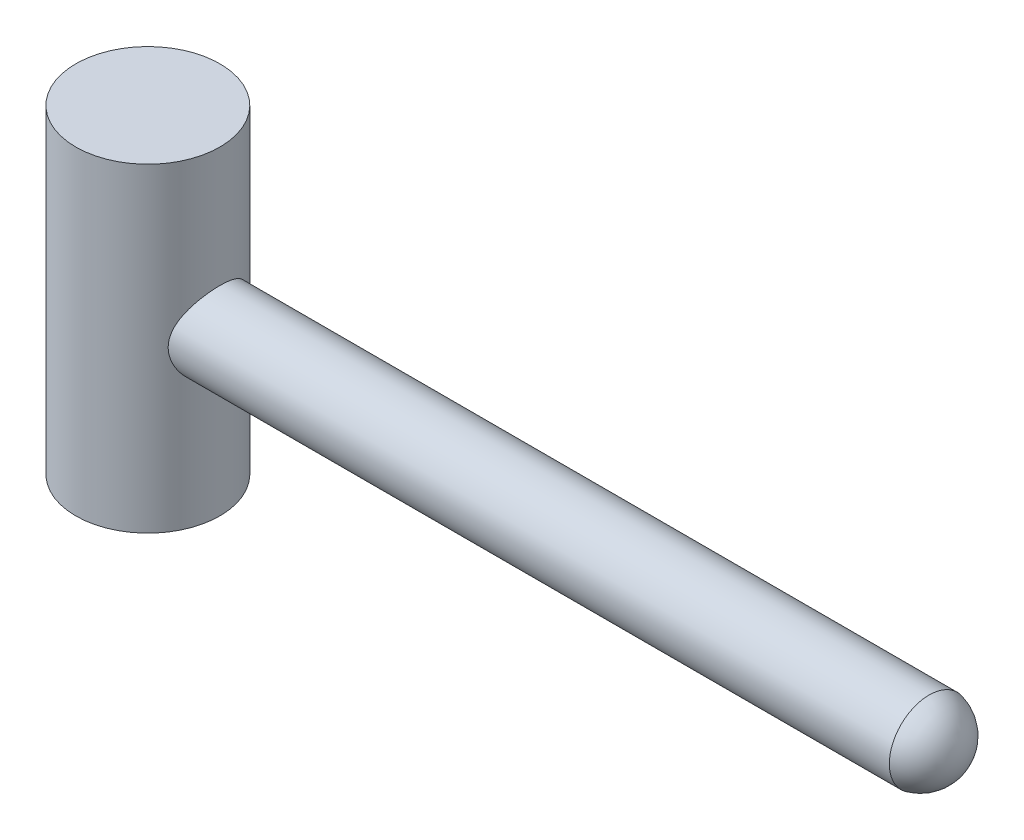
ISO-10303-21;
HEADER;
FILE_DESCRIPTION(('STEP AP214'),'2;1');
FILE_NAME('part.step','',(''),(''),'','','');
FILE_SCHEMA(('AUTOMOTIVE_DESIGN { 1 0 10303 214 1 1 1 1 }'));
ENDSEC;
DATA;
#1=APPLICATION_CONTEXT('core data for automotive mechanical design processes');
#2=APPLICATION_PROTOCOL_DEFINITION('international standard','automotive_design',2000,#1);
#3=PRODUCT_CONTEXT('',#1,'mechanical');
#4=PRODUCT('Part','Part','',(#3));
#5=PRODUCT_RELATED_PRODUCT_CATEGORY('part','',(#4));
#6=PRODUCT_DEFINITION_FORMATION('','',#4);
#7=PRODUCT_DEFINITION_CONTEXT('part definition',#1,'design');
#8=PRODUCT_DEFINITION('design','',#6,#7);
#9=PRODUCT_DEFINITION_SHAPE('','',#8);
#10=(LENGTH_UNIT() NAMED_UNIT(*) SI_UNIT(.MILLI.,.METRE.));
#11=(NAMED_UNIT(*) PLANE_ANGLE_UNIT() SI_UNIT($,.RADIAN.));
#12=(NAMED_UNIT(*) SI_UNIT($,.STERADIAN.) SOLID_ANGLE_UNIT());
#13=UNCERTAINTY_MEASURE_WITH_UNIT(LENGTH_MEASURE(1.E-05),#10,'distance_accuracy_value','');
#14=(GEOMETRIC_REPRESENTATION_CONTEXT(3) GLOBAL_UNCERTAINTY_ASSIGNED_CONTEXT((#13)) GLOBAL_UNIT_ASSIGNED_CONTEXT((#10,
#11,#12)) REPRESENTATION_CONTEXT('',''));
#15=CARTESIAN_POINT('',(0.,0.,0.));
#16=DIRECTION('',(0.,0.,1.));
#17=DIRECTION('',(1.,0.,0.));
#18=AXIS2_PLACEMENT_3D('',#15,#16,#17);
#19=CARTESIAN_POINT('',(122.61083828125,25.35555,0.));
#20=DIRECTION('',(0.,0.,1.));
#21=DIRECTION('',(1.,0.,0.));
#22=AXIS2_PLACEMENT_3D('',#19,#20,#21);
#23=SPHERICAL_SURFACE('',#22,6.46916171875);
#24=CARTESIAN_POINT('',(122.61083828125,25.35555,0.));
#25=DIRECTION('',(1.,0.,0.));
#26=DIRECTION('',(0.,0.,-1.));
#27=AXIS2_PLACEMENT_3D('',#24,#25,#26);
#28=SPHERICAL_SURFACE('',#27,6.46916171875);
#29=CARTESIAN_POINT('',(124.,25.35555,0.));
#30=DIRECTION('',(1.,0.,0.));
#31=DIRECTION('',(0.,0.,-1.));
#32=AXIS2_PLACEMENT_3D('',#29,#30,#31);
#33=CIRCLE('',#32,6.31825);
#34=CARTESIAN_POINT('',(124.,25.35555,-6.31825));
#35=VERTEX_POINT('',#34);
#36=EDGE_CURVE('E46',#35,#35,#33,.T.);
#37=ORIENTED_EDGE('',*,*,#36,.T.);
#38=EDGE_LOOP('',(#37));
#39=FACE_BOUND('',#38,.T.);
#40=ADVANCED_FACE('F43',(#39),#28,.T.);
#41=CARTESIAN_POINT('',(-11.4437,25.35555,0.));
#42=DIRECTION('',(1.,0.,0.));
#43=DIRECTION('',(0.,0.,-1.));
#44=AXIS2_PLACEMENT_3D('',#41,#42,#43);
#45=CYLINDRICAL_SURFACE('',#44,6.31825);
#46=ORIENTED_EDGE('',*,*,#36,.F.);
#47=EDGE_LOOP('',(#46));
#48=FACE_BOUND('',#47,.T.);
#49=CARTESIAN_POINT('',(9.54018344831482,25.35555,-6.31825));
#50=CARTESIAN_POINT('',(9.54018083450571,25.5174026483117,-6.31825193716623));
#51=CARTESIAN_POINT('',(9.54431541598027,25.6792345645507,-6.31202368990268));
#52=CARTESIAN_POINT('',(9.56067795907703,26.001592677448,-6.28721284744562));
#53=CARTESIAN_POINT('',(9.57290851539357,26.1621184387925,-6.26862629150579));
#54=CARTESIAN_POINT('',(9.60499472694268,26.4807092664191,-6.21935034099246));
#55=CARTESIAN_POINT('',(9.62485935965734,26.6387712067256,-6.18864669587816));
#56=CARTESIAN_POINT('',(9.67146819999295,26.9511925238964,-6.11555079440456));
#57=CARTESIAN_POINT('',(9.69821549059936,27.1055502075305,-6.07315329934378));
#58=CARTESIAN_POINT('',(9.7574543259979,27.408533890213,-5.97750831606688));
#59=CARTESIAN_POINT('',(9.7899057269653,27.5571916355862,-5.92433628035336));
#60=CARTESIAN_POINT('',(9.85967018013938,27.8491647397997,-5.80748795258423));
#61=CARTESIAN_POINT('',(9.89698502218243,27.9924781067135,-5.74380779103673));
#62=CARTESIAN_POINT('',(10.0146317823642,28.4133707438515,-5.53782734180906));
#63=CARTESIAN_POINT('',(10.1007135163746,28.6821319599226,-5.38051374205728));
#64=CARTESIAN_POINT('',(10.2890953952598,29.2181636164552,-5.01167571487228));
#65=CARTESIAN_POINT('',(10.3921543154347,29.4824896715789,-4.79625999310393));
#66=CARTESIAN_POINT('',(10.545539677052,29.8506261094333,-4.44336925767475));
#67=CARTESIAN_POINT('',(10.5964998662239,29.9686792927549,-4.32068972865352));
#68=CARTESIAN_POINT('',(10.6968893853317,30.1948291258404,-4.06579388094318));
#69=CARTESIAN_POINT('',(10.7463184577425,30.3029241066632,-3.93357597026943));
#70=CARTESIAN_POINT('',(10.8466753405652,30.5174312066391,-3.64826495023383));
#71=CARTESIAN_POINT('',(10.8973584262176,30.622875900733,-3.49435675412639));
#72=CARTESIAN_POINT('',(10.9941216278436,30.8202555028633,-3.17682261796556));
#73=CARTESIAN_POINT('',(11.0402037525615,30.9121963149234,-3.01320096892584));
#74=CARTESIAN_POINT('',(11.1264539664538,31.0816477451478,-2.67721366859669));
#75=CARTESIAN_POINT('',(11.1666240130375,31.1591631416307,-2.50485093688985));
#76=CARTESIAN_POINT('',(11.2398502232944,31.2988380153705,-2.15255665331606));
#77=CARTESIAN_POINT('',(11.2729073423789,31.3609995551303,-1.97262612184548));
#78=CARTESIAN_POINT('',(11.3284311476939,31.4645594020492,-1.6219907629106));
#79=CARTESIAN_POINT('',(11.351552551889,31.5072598751589,-1.45177381338647));
#80=CARTESIAN_POINT('',(11.39028996694,31.5784512395761,-1.10754875516793));
#81=CARTESIAN_POINT('',(11.4059063609973,31.606942856382,-0.933540840512275));
#82=CARTESIAN_POINT('',(11.4291679613515,31.6492844197094,-0.583335521032256));
#83=CARTESIAN_POINT('',(11.4368182806275,31.6631437579539,-0.407139594160962));
#84=CARTESIAN_POINT('',(11.4439343409746,31.6760376331608,-0.0540465185126677));
#85=CARTESIAN_POINT('',(11.4434007373399,31.6750733570637,0.122850572987492));
#86=CARTESIAN_POINT('',(11.4346590427355,31.6592283100193,0.457027885252577));
#87=CARTESIAN_POINT('',(11.4272692497607,31.645831358497,0.614402614893631));
#88=CARTESIAN_POINT('',(11.4061395473673,31.6073640161748,0.927341807384519));
#89=CARTESIAN_POINT('',(11.3923975289374,31.5822897483521,1.08290565140035));
#90=CARTESIAN_POINT('',(11.3588905228775,31.5207716421278,1.39104365098228));
#91=CARTESIAN_POINT('',(11.3391276420118,31.4843317805635,1.54361883247003));
#92=CARTESIAN_POINT('',(11.2940179234123,31.4004643415916,1.844928788867));
#93=CARTESIAN_POINT('',(11.2686689076748,31.3530324780888,1.99366204048838));
#94=CARTESIAN_POINT('',(11.2126570039406,31.2471219033813,2.28787046353328));
#95=CARTESIAN_POINT('',(11.1819427833033,31.1885359356642,2.43329723164134));
#96=CARTESIAN_POINT('',(11.116031930798,31.0611634348307,2.7185817296359));
#97=CARTESIAN_POINT('',(11.0808337956905,30.9923734795336,2.85843757112398));
#98=CARTESIAN_POINT('',(10.9695818113794,30.7715340965249,3.26859996716568));
#99=CARTESIAN_POINT('',(10.8878343316732,30.6049488647042,3.52968360924174));
#100=CARTESIAN_POINT('',(10.7060396033736,30.2172986616059,4.04969324633373));
#101=CARTESIAN_POINT('',(10.6049692405009,29.9922856200651,4.3053176773251));
#102=CARTESIAN_POINT('',(10.452079753232,29.6267438590519,4.65897195333611));
#103=CARTESIAN_POINT('',(10.4008584261284,29.5001064067945,4.77197650400648));
#104=CARTESIAN_POINT('',(10.2991849081828,29.2379103820021,4.98762077818439));
#105=CARTESIAN_POINT('',(10.2487328551366,29.1023502337869,5.09025866286293));
#106=CARTESIAN_POINT('',(10.1454802537442,28.810392859961,5.29327162179075));
#107=CARTESIAN_POINT('',(10.0928724866809,28.6532159938287,5.39262560903304));
#108=CARTESIAN_POINT('',(9.99186583673085,28.329750763453,5.57755304227524));
#109=CARTESIAN_POINT('',(9.94346507048578,28.1634665312419,5.66313266944357));
#110=CARTESIAN_POINT('',(9.85266367450871,27.8226986251384,5.81967273107332));
#111=CARTESIAN_POINT('',(9.81025912606465,27.6482204065313,5.89064272733038));
#112=CARTESIAN_POINT('',(9.73319553671579,27.2920898332284,6.01712419193141));
#113=CARTESIAN_POINT('',(9.69853524115111,27.1104386462573,6.07263816469182));
#114=CARTESIAN_POINT('',(9.6410124228877,26.7562783079375,6.1635152022213));
#115=CARTESIAN_POINT('',(9.61742439812244,26.5842116259138,6.20014137176319));
#116=CARTESIAN_POINT('',(9.57922774567819,26.2366401641717,6.25899502028769));
#117=CARTESIAN_POINT('',(9.5646185381747,26.0611356072162,6.28122342903857));
#118=CARTESIAN_POINT('',(9.54508923026198,25.7085153463077,6.31086147217007));
#119=CARTESIAN_POINT('',(9.54015945859028,25.531401428349,6.31828589814829));
#120=CARTESIAN_POINT('',(9.54020760412019,25.1771881077736,6.31821385255547));
#121=CARTESIAN_POINT('',(9.54518442024437,25.0000887057314,6.31071903919795));
#122=CARTESIAN_POINT('',(9.5633410550197,24.6737037568798,6.28316042864985));
#123=CARTESIAN_POINT('',(9.57520282169451,24.5241682615774,6.26511335924048));
#124=CARTESIAN_POINT('',(9.60552370934576,24.2273732833519,6.21852645105008));
#125=CARTESIAN_POINT('',(9.62398493949125,24.0801145437881,6.18998325765507));
#126=CARTESIAN_POINT('',(9.66689971041823,23.7888331692112,6.12274603477511));
#127=CARTESIAN_POINT('',(9.69135309621818,23.6448104506067,6.08405226782347));
#128=CARTESIAN_POINT('',(9.74550758145019,23.3607326255178,5.9969236926659));
#129=CARTESIAN_POINT('',(9.7752107887268,23.2206791390185,5.94848497069976));
#130=CARTESIAN_POINT('',(9.87361696981369,22.796071648613,5.78478427369969));
#131=CARTESIAN_POINT('',(9.94975291722133,22.5190725616918,5.65391365749246));
#132=CARTESIAN_POINT('',(10.1134480662533,21.9894769099628,5.35560492743553));
#133=CARTESIAN_POINT('',(10.2010128826616,21.7368924464548,5.18814881240195));
#134=CARTESIAN_POINT('',(10.3945533384985,21.2206149511117,4.79008766212784));
#135=CARTESIAN_POINT('',(10.5012336432458,20.9616064074973,4.55366626720769));
#136=CARTESIAN_POINT('',(10.6572272045517,20.6044626450312,4.16871657809543));
#137=CARTESIAN_POINT('',(10.7085874053152,20.4905762624365,4.03524615433454));
#138=CARTESIAN_POINT('',(10.8087765961234,20.2738382261951,3.75863475188307));
#139=CARTESIAN_POINT('',(10.8576052370842,20.1709880922873,3.61549244574417));
#140=CARTESIAN_POINT('',(10.9539558573926,19.9720555010237,3.31252326955556));
#141=CARTESIAN_POINT('',(11.0012764665065,19.8766068733863,3.15221547468949));
#142=CARTESIAN_POINT('',(11.0904079734455,19.6997672438501,2.82264952650407));
#143=CARTESIAN_POINT('',(11.1322214934511,19.6183695458748,2.65339568700172));
#144=CARTESIAN_POINT('',(11.2091092769328,19.4705680203339,2.30709548342573));
#145=CARTESIAN_POINT('',(11.2441874347245,19.4041555245676,2.13005369549112));
#146=CARTESIAN_POINT('',(11.3065370517694,19.2871785062341,1.76947939198127));
#147=CARTESIAN_POINT('',(11.3338096806732,19.2366116091121,1.58594785352441));
#148=CARTESIAN_POINT('',(11.3773137114536,19.1564228322756,1.23305398186738));
#149=CARTESIAN_POINT('',(11.39438871767,19.1251884394831,1.06416072349592));
#150=CARTESIAN_POINT('',(11.4210598293378,19.0765434113741,0.72381040611467));
#151=CARTESIAN_POINT('',(11.4306564500338,19.0591318236947,0.552353524562676));
#152=CARTESIAN_POINT('',(11.4420953000866,19.0383893143024,0.208409610648593));
#153=CARTESIAN_POINT('',(11.4439410054889,19.0350520806746,0.0359230748181656));
#154=CARTESIAN_POINT('',(11.4398339122471,19.0424912714338,-0.308647615296851));
#155=CARTESIAN_POINT('',(11.4338815127189,19.0532669735046,-0.480731789723191));
#156=CARTESIAN_POINT('',(11.4152396761079,19.0871552013095,-0.807458213504667));
#157=CARTESIAN_POINT('',(11.4032108851495,19.1090589800796,-0.962265686486694));
#158=CARTESIAN_POINT('',(11.3731270615357,19.1641485396049,-1.26931736145731));
#159=CARTESIAN_POINT('',(11.3550700157174,19.1973380893634,-1.42156068927259));
#160=CARTESIAN_POINT('',(11.3133440893793,19.2746199010994,-1.72240736469467));
#161=CARTESIAN_POINT('',(11.2896769988914,19.3187086855825,-1.87101185671468));
#162=CARTESIAN_POINT('',(11.237231479519,19.4173671105332,-2.16382736847649));
#163=CARTESIAN_POINT('',(11.2084510576831,19.4719408382473,-2.30803664939061));
#164=CARTESIAN_POINT('',(11.14534502107,19.5930524616944,-2.59597770929443));
#165=CARTESIAN_POINT('',(11.1108668261722,19.6599278795733,-2.73953412071516));
#166=CARTESIAN_POINT('',(11.0378194327741,19.8037767739834,-3.02043377712664));
#167=CARTESIAN_POINT('',(10.9992488497666,19.8807536700731,-3.15777489684402));
#168=CARTESIAN_POINT('',(10.8785650577738,20.1259784879646,-3.55952966698808));
#169=CARTESIAN_POINT('',(10.7914449989538,20.3085854710545,-3.81382768123789));
#170=CARTESIAN_POINT('',(10.6001123086635,20.7309712070589,-4.31904919359707));
#171=CARTESIAN_POINT('',(10.4950878616335,20.9749181308879,-4.5661869924381));
#172=CARTESIAN_POINT('',(10.3389735560817,21.3688479031258,-4.90474938632341));
#173=CARTESIAN_POINT('',(10.2871231612954,21.5049710048601,-5.01233439597718));
#174=CARTESIAN_POINT('',(10.1852241667688,21.786115234271,-5.21627880587937));
#175=CARTESIAN_POINT('',(10.1351758833466,21.9311379120928,-5.31263624196634));
#176=CARTESIAN_POINT('',(10.034993793116,22.23966879057,-5.49966412141194));
#177=CARTESIAN_POINT('',(9.98508892341964,22.4037627757755,-5.58949299419639));
#178=CARTESIAN_POINT('',(9.89078163207796,22.7404862792625,-5.75472592221684));
#179=CARTESIAN_POINT('',(9.84637643568214,22.9131114313003,-5.83013726205893));
#180=CARTESIAN_POINT('',(9.76493934970742,23.2655161552741,-5.96553254996415));
#181=CARTESIAN_POINT('',(9.72788995788761,23.445277493052,-6.02555322001653));
#182=CARTESIAN_POINT('',(9.66275202020167,23.8108846753492,-6.12946783540336));
#183=CARTESIAN_POINT('',(9.63465779190076,23.9967265785971,-6.17337201003712));
#184=CARTESIAN_POINT('',(9.58837039689559,24.3767622986211,-6.2450305323558));
#185=CARTESIAN_POINT('',(9.57039305175588,24.5710492970187,-6.27243366371845));
#186=CARTESIAN_POINT('',(9.54630136375788,24.9620844604596,-6.30904191678416));
#187=CARTESIAN_POINT('',(9.54018662516664,25.1588325431814,-6.31824764554724));
#188=CARTESIAN_POINT('',(9.54018344831482,25.35555,-6.31825));
#189=B_SPLINE_CURVE_WITH_KNOTS('',3,(#49,#50,#51,#52,#53,#54,#55,#56,#57,#58,#59,#60,#61,#62,
#63,#64,#65,#66,#67,#68,#69,#70,#71,#72,#73,#74,#75,#76,#77,#78,#79,#80,#81,#82,#83,#84,#85,#86,
#87,#88,#89,#90,#91,#92,#93,#94,#95,#96,#97,#98,#99,#100,#101,#102,#103,#104,#105,#106,#107,
#108,#109,#110,#111,#112,#113,#114,#115,#116,#117,#118,#119,#120,#121,#122,#123,#124,#125,#126,
#127,#128,#129,#130,#131,#132,#133,#134,#135,#136,#137,#138,#139,#140,#141,#142,#143,#144,#145,
#146,#147,#148,#149,#150,#151,#152,#153,#154,#155,#156,#157,#158,#159,#160,#161,#162,#163,#164,
#165,#166,#167,#168,#169,#170,#171,#172,#173,#174,#175,#176,#177,#178,#179,#180,#181,#182,#183,
#184,#185,#186,#187,#188),.UNSPECIFIED.,.T.,.F.,(4,2,2,2,2,2,2,2,2,2,2,2,2,2,2,2,2,2,2,2,2,2,2,
2,2,2,2,2,2,2,2,2,2,2,2,2,2,2,2,2,2,2,2,2,2,2,2,2,2,2,2,2,2,2,2,2,2,2,2,2,2,2,2,2,2,2,2,2,2,4),
(0.,0.485351756978696,0.970859140623713,1.45693922453984,1.94323742106097,2.42624104403441,
2.90942292586519,3.87505813005177,4.93912182566507,5.47183619413963,6.00463968087176,
6.58387099543677,7.1628483059513,7.74163349156287,8.32034088590026,8.85062344017552,
9.38087891566387,9.9107938395523,10.4406663328801,10.9144535308681,11.3883981447163,
11.8621771103639,12.3361411277196,12.8149167050759,13.2938532172209,14.2511408914147,
15.312195227346,15.8436284199912,16.3751557127931,16.9541621542085,17.5329080408623,
18.1112739337746,18.689546056568,19.2212311058764,19.7528818169856,20.2840010554502,
20.8150612654412,21.2677993061016,21.7206821700557,22.1735533218518,22.6266067197603,
23.5696938416735,24.5132460405239,25.6077083409088,26.1556840062023,26.7037350335321,
27.2804039301112,27.8567972475036,28.4328562901203,29.0088289656264,29.5259320515408,
30.0429995070205,30.5598350489739,31.0766441397254,31.5465370314592,32.0165870032899,
32.4864871947625,32.9565709360294,33.442287681688,33.9281692786929,34.8994285170005,
35.9829235912092,36.5257198918275,37.0686110075847,37.6486866693367,38.2284684628357,
38.8068537530609,39.3848712990508,39.9747927463764,40.5646945137632),.UNSPECIFIED.);
#190=CARTESIAN_POINT('',(9.54018344831482,25.35555,-6.31825));
#191=VERTEX_POINT('',#190);
#192=EDGE_CURVE('E11',#191,#191,#189,.T.);
#193=ORIENTED_EDGE('',*,*,#192,.T.);
#194=EDGE_LOOP('',(#193));
#195=FACE_BOUND('',#194,.T.);
#196=ADVANCED_FACE('F57',(#48,#195),#45,.T.);
#197=CARTESIAN_POINT('',(0.,50.7111,0.));
#198=DIRECTION('',(0.,-1.,0.));
#199=DIRECTION('',(0.,0.,-1.));
#200=AXIS2_PLACEMENT_3D('',#197,#198,#199);
#201=CYLINDRICAL_SURFACE('',#200,11.4427);
#202=ORIENTED_EDGE('',*,*,#192,.F.);
#203=EDGE_LOOP('',(#202));
#204=FACE_BOUND('',#203,.T.);
#205=ADVANCED_FACE('F59',(#204),#201,.F.);
#206=CLOSED_SHELL('',(#40,#196,#205));
#207=MANIFOLD_SOLID_BREP('B2',#206);
#208=CARTESIAN_POINT('',(0.,50.7111,0.));
#209=DIRECTION('',(0.,-1.,0.));
#210=DIRECTION('',(0.,0.,-1.));
#211=AXIS2_PLACEMENT_3D('',#208,#209,#210);
#212=CYLINDRICAL_SURFACE('',#211,11.4427);
#213=CARTESIAN_POINT('',(0.,50.7111,0.));
#214=DIRECTION('',(0.,1.,0.));
#215=DIRECTION('',(0.,0.,1.));
#216=AXIS2_PLACEMENT_3D('',#213,#214,#215);
#217=CIRCLE('',#216,11.4427);
#218=CARTESIAN_POINT('',(0.,50.7111,11.4427));
#219=VERTEX_POINT('',#218);
#220=EDGE_CURVE('E42',#219,#219,#217,.T.);
#221=ORIENTED_EDGE('',*,*,#220,.F.);
#222=EDGE_LOOP('',(#221));
#223=FACE_BOUND('',#222,.T.);
#224=CARTESIAN_POINT('',(0.,0.,0.));
#225=DIRECTION('',(0.,1.,0.));
#226=DIRECTION('',(0.,0.,1.));
#227=AXIS2_PLACEMENT_3D('',#224,#225,#226);
#228=CIRCLE('',#227,11.4427);
#229=CARTESIAN_POINT('',(0.,0.,11.4427));
#230=VERTEX_POINT('',#229);
#231=EDGE_CURVE('E92',#230,#230,#228,.T.);
#232=ORIENTED_EDGE('',*,*,#231,.T.);
#233=EDGE_LOOP('',(#232));
#234=FACE_BOUND('',#233,.T.);
#235=ADVANCED_FACE('F89',(#223,#234),#212,.T.);
#236=CARTESIAN_POINT('',(0.,50.7111,0.));
#237=DIRECTION('',(0.,1.,0.));
#238=DIRECTION('',(0.,0.,1.));
#239=AXIS2_PLACEMENT_3D('',#236,#237,#238);
#240=PLANE('',#239);
#241=ORIENTED_EDGE('',*,*,#220,.T.);
#242=EDGE_LOOP('',(#241));
#243=FACE_BOUND('',#242,.T.);
#244=ADVANCED_FACE('F104',(#243),#240,.T.);
#245=CARTESIAN_POINT('',(0.,0.,0.));
#246=DIRECTION('',(0.,1.,0.));
#247=DIRECTION('',(0.,0.,1.));
#248=AXIS2_PLACEMENT_3D('',#245,#246,#247);
#249=PLANE('',#248);
#250=ORIENTED_EDGE('',*,*,#231,.F.);
#251=EDGE_LOOP('',(#250));
#252=FACE_BOUND('',#251,.T.);
#253=ADVANCED_FACE('F102',(#252),#249,.F.);
#254=CLOSED_SHELL('',(#235,#244,#253));
#255=MANIFOLD_SOLID_BREP('B6',#254);
#256=ADVANCED_BREP_SHAPE_REPRESENTATION('',(#18,#207,#255),#14);
#257=SHAPE_DEFINITION_REPRESENTATION(#9,#256);
ENDSEC;
END-ISO-10303-21;
